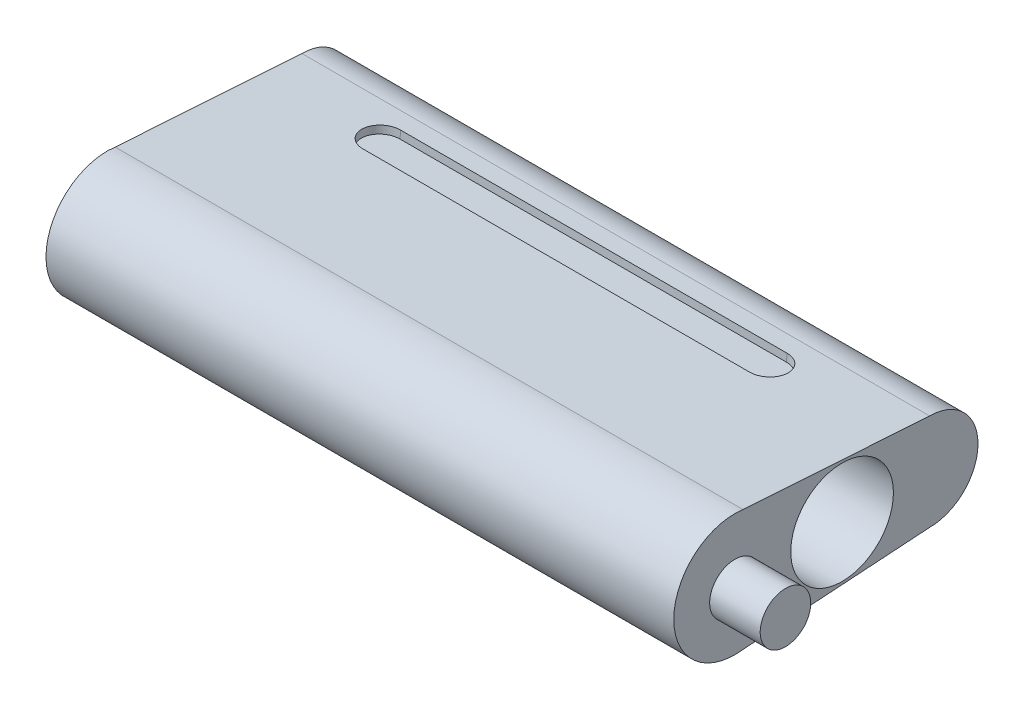
ISO-10303-21;
HEADER;
FILE_DESCRIPTION(('STEP AP214'),'2;1');
FILE_NAME('part.step','',(''),(''),'','','');
FILE_SCHEMA(('AUTOMOTIVE_DESIGN { 1 0 10303 214 1 1 1 1 }'));
ENDSEC;
DATA;
#1=APPLICATION_CONTEXT('core data for automotive mechanical design processes');
#2=APPLICATION_PROTOCOL_DEFINITION('international standard','automotive_design',2000,#1);
#3=PRODUCT_CONTEXT('',#1,'mechanical');
#4=PRODUCT('Part','Part','',(#3));
#5=PRODUCT_RELATED_PRODUCT_CATEGORY('part','',(#4));
#6=PRODUCT_DEFINITION_FORMATION('','',#4);
#7=PRODUCT_DEFINITION_CONTEXT('part definition',#1,'design');
#8=PRODUCT_DEFINITION('design','',#6,#7);
#9=PRODUCT_DEFINITION_SHAPE('','',#8);
#10=(LENGTH_UNIT() NAMED_UNIT(*) SI_UNIT(.MILLI.,.METRE.));
#11=(NAMED_UNIT(*) PLANE_ANGLE_UNIT() SI_UNIT($,.RADIAN.));
#12=(NAMED_UNIT(*) SI_UNIT($,.STERADIAN.) SOLID_ANGLE_UNIT());
#13=UNCERTAINTY_MEASURE_WITH_UNIT(LENGTH_MEASURE(1.E-05),#10,'distance_accuracy_value','');
#14=(GEOMETRIC_REPRESENTATION_CONTEXT(3) GLOBAL_UNCERTAINTY_ASSIGNED_CONTEXT((#13)) GLOBAL_UNIT_ASSIGNED_CONTEXT((#10,
#11,#12)) REPRESENTATION_CONTEXT('',''));
#15=CARTESIAN_POINT('',(0.,0.,0.));
#16=DIRECTION('',(0.,0.,1.));
#17=DIRECTION('',(1.,0.,0.));
#18=AXIS2_PLACEMENT_3D('',#15,#16,#17);
#19=CARTESIAN_POINT('',(12.4192495140172,0.,0.));
#20=DIRECTION('',(-1.,0.,0.));
#21=DIRECTION('',(0.,0.,1.));
#22=AXIS2_PLACEMENT_3D('',#19,#20,#21);
#23=CYLINDRICAL_SURFACE('',#22,1.20962475700856);
#24=CARTESIAN_POINT('',(0.,0.,0.));
#25=DIRECTION('',(1.,0.,0.));
#26=DIRECTION('',(0.,0.,-1.));
#27=AXIS2_PLACEMENT_3D('',#24,#25,#26);
#28=CIRCLE('',#27,1.20962475700856);
#29=CARTESIAN_POINT('',(0.,1.19906290371935,-0.159499861103787));
#30=VERTEX_POINT('',#29);
#31=CARTESIAN_POINT('',(0.,-1.19906290371935,-0.159499861103784));
#32=VERTEX_POINT('',#31);
#33=EDGE_CURVE('E168',#30,#32,#28,.T.);
#34=ORIENTED_EDGE('',*,*,#33,.T.);
#35=DIRECTION('',(-1.,0.,0.));
#36=VECTOR('',#35,1.);
#37=CARTESIAN_POINT('',(12.4192495140172,-1.19906290371935,-0.159499861103784));
#38=LINE('',#37,#36);
#39=CARTESIAN_POINT('',(12.4192495140172,-1.19906290371935,-0.159499861103784));
#40=VERTEX_POINT('',#39);
#41=EDGE_CURVE('E50',#40,#32,#38,.T.);
#42=ORIENTED_EDGE('',*,*,#41,.F.);
#43=CARTESIAN_POINT('',(12.4192495140172,0.,0.));
#44=DIRECTION('',(1.,0.,0.));
#45=DIRECTION('',(0.,0.,-1.));
#46=AXIS2_PLACEMENT_3D('',#43,#44,#45);
#47=CIRCLE('',#46,1.20962475700856);
#48=CARTESIAN_POINT('',(12.4192495140172,1.19906290371935,-0.159499861103787));
#49=VERTEX_POINT('',#48);
#50=EDGE_CURVE('E159',#49,#40,#47,.T.);
#51=ORIENTED_EDGE('',*,*,#50,.F.);
#52=DIRECTION('',(-1.,0.,0.));
#53=VECTOR('',#52,1.);
#54=CARTESIAN_POINT('',(12.4192495140172,1.19906290371935,-0.159499861103787));
#55=LINE('',#54,#53);
#56=EDGE_CURVE('E63',#49,#30,#55,.T.);
#57=ORIENTED_EDGE('',*,*,#56,.T.);
#58=EDGE_LOOP('',(#34,#42,#51,#57));
#59=FACE_BOUND('',#58,.T.);
#60=ADVANCED_FACE('F39',(#59),#23,.T.);
#61=CARTESIAN_POINT('',(12.4192495140172,-1.19906290371935,-0.159499861103784));
#62=DIRECTION('',(0.,0.997814734263866,0.0660738684044652));
#63=DIRECTION('',(0.,-0.0660738684044652,0.997814734263866));
#64=AXIS2_PLACEMENT_3D('',#61,#62,#63);
#65=PLANE('',#64);
#66=DIRECTION('',(0.,0.0660738684044652,-0.997814734263866));
#67=VECTOR('',#66,1.);
#68=CARTESIAN_POINT('',(0.,-1.19906290371935,-0.159499861103784));
#69=LINE('',#68,#67);
#70=CARTESIAN_POINT('',(0.,-0.954395011226381,-3.85435281925565));
#71=VERTEX_POINT('',#70);
#72=EDGE_CURVE('E166',#32,#71,#69,.T.);
#73=ORIENTED_EDGE('',*,*,#72,.T.);
#74=DIRECTION('',(-1.,0.,0.));
#75=VECTOR('',#74,1.);
#76=CARTESIAN_POINT('',(12.4192495140172,-0.954395011226381,-3.85435281925565));
#77=LINE('',#76,#75);
#78=CARTESIAN_POINT('',(12.4192495140172,-0.954395011226381,-3.85435281925565));
#79=VERTEX_POINT('',#78);
#80=EDGE_CURVE('E178',#79,#71,#77,.T.);
#81=ORIENTED_EDGE('',*,*,#80,.F.);
#82=DIRECTION('',(0.,0.0660738684044652,-0.997814734263866));
#83=VECTOR('',#82,1.);
#84=CARTESIAN_POINT('',(12.4192495140172,-1.19906290371935,-0.159499861103784));
#85=LINE('',#84,#83);
#86=EDGE_CURVE('E92',#40,#79,#85,.T.);
#87=ORIENTED_EDGE('',*,*,#86,.F.);
#88=ORIENTED_EDGE('',*,*,#41,.T.);
#89=EDGE_LOOP('',(#73,#81,#87,#88));
#90=FACE_BOUND('',#89,.T.);
#91=ADVANCED_FACE('F181',(#90),#65,.F.);
#92=CARTESIAN_POINT('',(12.4192495140172,0.,-3.85435281925565));
#93=DIRECTION('',(-1.,0.,0.));
#94=DIRECTION('',(0.,0.,1.));
#95=AXIS2_PLACEMENT_3D('',#92,#93,#94);
#96=CYLINDRICAL_SURFACE('',#95,0.954395011226381);
#97=CARTESIAN_POINT('',(0.,0.,-3.85435281925565));
#98=DIRECTION('',(1.,0.,0.));
#99=DIRECTION('',(0.,0.,-1.));
#100=AXIS2_PLACEMENT_3D('',#97,#98,#99);
#101=CIRCLE('',#100,0.954395011226381);
#102=CARTESIAN_POINT('',(0.,0.954395011226381,-3.85435281925565));
#103=VERTEX_POINT('',#102);
#104=EDGE_CURVE('E167',#71,#103,#101,.T.);
#105=ORIENTED_EDGE('',*,*,#104,.T.);
#106=DIRECTION('',(-1.,0.,0.));
#107=VECTOR('',#106,1.);
#108=CARTESIAN_POINT('',(12.4192495140172,0.954395011226381,-3.85435281925565));
#109=LINE('',#108,#107);
#110=CARTESIAN_POINT('',(12.4192495140172,0.954395011226381,-3.85435281925565));
#111=VERTEX_POINT('',#110);
#112=EDGE_CURVE('E176',#111,#103,#109,.T.);
#113=ORIENTED_EDGE('',*,*,#112,.F.);
#114=CARTESIAN_POINT('',(12.4192495140172,0.,-3.85435281925565));
#115=DIRECTION('',(1.,0.,0.));
#116=DIRECTION('',(0.,0.,-1.));
#117=AXIS2_PLACEMENT_3D('',#114,#115,#116);
#118=CIRCLE('',#117,0.954395011226381);
#119=EDGE_CURVE('E162',#79,#111,#118,.T.);
#120=ORIENTED_EDGE('',*,*,#119,.F.);
#121=ORIENTED_EDGE('',*,*,#80,.T.);
#122=EDGE_LOOP('',(#105,#113,#120,#121));
#123=FACE_BOUND('',#122,.T.);
#124=ADVANCED_FACE('F188',(#123),#96,.T.);
#125=CARTESIAN_POINT('',(12.4192495140172,1.19906290371935,-0.159499861103787));
#126=DIRECTION('',(0.,0.997814734263866,-0.0660738684044652));
#127=DIRECTION('',(0.,0.0660738684044652,0.997814734263866));
#128=AXIS2_PLACEMENT_3D('',#125,#126,#127);
#129=PLANE('',#128);
#130=CARTESIAN_POINT('',(2.31054073287263,1.002900322382,-3.12184970826995));
#131=DIRECTION('',(0.,0.997814734263866,-0.0660738684044652));
#132=DIRECTION('',(0.,0.0660738684044652,0.997814734263866));
#133=AXIS2_PLACEMENT_3D('',#130,#131,#132);
#134=CIRCLE('',#133,0.373048868582557);
#135=CARTESIAN_POINT('',(2.31054073287263,0.978251540530843,-3.49408336594209));
#136=VERTEX_POINT('',#135);
#137=CARTESIAN_POINT('',(2.31054073287263,1.02754910423316,-2.74961605059781));
#138=VERTEX_POINT('',#137);
#139=EDGE_CURVE('E54',#136,#138,#134,.T.);
#140=ORIENTED_EDGE('',*,*,#139,.F.);
#141=DIRECTION('',(-1.,0.,0.));
#142=VECTOR('',#141,1.);
#143=CARTESIAN_POINT('',(2.31054073287263,0.978251540530843,-3.49408336594209));
#144=LINE('',#143,#142);
#145=CARTESIAN_POINT('',(9.95593601481911,0.978251540530843,-3.49408336594209));
#146=VERTEX_POINT('',#145);
#147=EDGE_CURVE('E131',#146,#136,#144,.T.);
#148=ORIENTED_EDGE('',*,*,#147,.F.);
#149=CARTESIAN_POINT('',(9.95593601481911,1.002900322382,-3.12184970826995));
#150=DIRECTION('',(0.,0.997814734263866,-0.0660738684044652));
#151=DIRECTION('',(0.,0.0660738684044652,0.997814734263866));
#152=AXIS2_PLACEMENT_3D('',#149,#150,#151);
#153=CIRCLE('',#152,0.373048868582557);
#154=CARTESIAN_POINT('',(9.95593601481911,1.02754910423316,-2.74961605059781));
#155=VERTEX_POINT('',#154);
#156=EDGE_CURVE('E140',#155,#146,#153,.T.);
#157=ORIENTED_EDGE('',*,*,#156,.F.);
#158=DIRECTION('',(1.,0.,0.));
#159=VECTOR('',#158,1.);
#160=CARTESIAN_POINT('',(2.31054073287263,1.02754910423316,-2.74961605059781));
#161=LINE('',#160,#159);
#162=EDGE_CURVE('E141',#138,#155,#161,.T.);
#163=ORIENTED_EDGE('',*,*,#162,.F.);
#164=EDGE_LOOP('',(#140,#148,#157,#163));
#165=FACE_BOUND('',#164,.T.);
#166=DIRECTION('',(0.,-0.0660738684044652,-0.997814734263866));
#167=VECTOR('',#166,1.);
#168=CARTESIAN_POINT('',(0.,1.19906290371935,-0.159499861103787));
#169=LINE('',#168,#167);
#170=EDGE_CURVE('E158',#30,#103,#169,.T.);
#171=ORIENTED_EDGE('',*,*,#170,.F.);
#172=ORIENTED_EDGE('',*,*,#56,.F.);
#173=DIRECTION('',(0.,-0.0660738684044652,-0.997814734263866));
#174=VECTOR('',#173,1.);
#175=CARTESIAN_POINT('',(12.4192495140172,1.19906290371935,-0.159499861103787));
#176=LINE('',#175,#174);
#177=EDGE_CURVE('E165',#49,#111,#176,.T.);
#178=ORIENTED_EDGE('',*,*,#177,.T.);
#179=ORIENTED_EDGE('',*,*,#112,.T.);
#180=EDGE_LOOP('',(#171,#172,#178,#179));
#181=FACE_BOUND('',#180,.T.);
#182=ADVANCED_FACE('F184',(#165,#181),#129,.T.);
#183=CARTESIAN_POINT('',(12.4192495140172,0.,0.));
#184=DIRECTION('',(1.,0.,0.));
#185=DIRECTION('',(0.,0.,-1.));
#186=AXIS2_PLACEMENT_3D('',#183,#184,#185);
#187=PLANE('',#186);
#188=CARTESIAN_POINT('',(12.4192495140172,-0.0732378778686819,0.));
#189=DIRECTION('',(1.,0.,0.));
#190=DIRECTION('',(0.,0.,-1.));
#191=AXIS2_PLACEMENT_3D('',#188,#189,#190);
#192=CIRCLE('',#191,0.5);
#193=CARTESIAN_POINT('',(12.4192495140172,-0.0732378778686819,-0.5));
#194=VERTEX_POINT('',#193);
#195=EDGE_CURVE('E11',#194,#194,#192,.T.);
#196=ORIENTED_EDGE('',*,*,#195,.F.);
#197=EDGE_LOOP('',(#196));
#198=FACE_BOUND('',#197,.T.);
#199=CARTESIAN_POINT('',(12.4192495140172,0.,-2.12008308742262));
#200=DIRECTION('',(1.,0.,0.));
#201=DIRECTION('',(0.,0.,-1.));
#202=AXIS2_PLACEMENT_3D('',#199,#200,#201);
#203=CIRCLE('',#202,1.01561898443626);
#204=CARTESIAN_POINT('',(12.4192495140172,0.,-3.13570207185888));
#205=VERTEX_POINT('',#204);
#206=EDGE_CURVE('E151',#205,#205,#203,.T.);
#207=ORIENTED_EDGE('',*,*,#206,.F.);
#208=EDGE_LOOP('',(#207));
#209=FACE_BOUND('',#208,.T.);
#210=ORIENTED_EDGE('',*,*,#50,.T.);
#211=ORIENTED_EDGE('',*,*,#86,.T.);
#212=ORIENTED_EDGE('',*,*,#119,.T.);
#213=ORIENTED_EDGE('',*,*,#177,.F.);
#214=EDGE_LOOP('',(#210,#211,#212,#213));
#215=FACE_BOUND('',#214,.T.);
#216=ADVANCED_FACE('F195',(#198,#209,#215),#187,.T.);
#217=CARTESIAN_POINT('',(0.,0.,0.));
#218=DIRECTION('',(1.,0.,0.));
#219=DIRECTION('',(0.,0.,-1.));
#220=AXIS2_PLACEMENT_3D('',#217,#218,#219);
#221=PLANE('',#220);
#222=CARTESIAN_POINT('',(0.,0.,-2.12008308742262));
#223=DIRECTION('',(1.,0.,0.));
#224=DIRECTION('',(0.,0.,-1.));
#225=AXIS2_PLACEMENT_3D('',#222,#223,#224);
#226=CIRCLE('',#225,1.01561898443626);
#227=CARTESIAN_POINT('',(0.,0.,-3.13570207185888));
#228=VERTEX_POINT('',#227);
#229=EDGE_CURVE('E45',#228,#228,#226,.T.);
#230=ORIENTED_EDGE('',*,*,#229,.T.);
#231=EDGE_LOOP('',(#230));
#232=FACE_BOUND('',#231,.T.);
#233=ORIENTED_EDGE('',*,*,#33,.F.);
#234=ORIENTED_EDGE('',*,*,#170,.T.);
#235=ORIENTED_EDGE('',*,*,#104,.F.);
#236=ORIENTED_EDGE('',*,*,#72,.F.);
#237=EDGE_LOOP('',(#233,#234,#235,#236));
#238=FACE_BOUND('',#237,.T.);
#239=ADVANCED_FACE('F182',(#232,#238),#221,.F.);
#240=CARTESIAN_POINT('',(-1.,0.,-2.12008308742262));
#241=DIRECTION('',(1.,0.,0.));
#242=DIRECTION('',(0.,0.,-1.));
#243=AXIS2_PLACEMENT_3D('',#240,#241,#242);
#244=CYLINDRICAL_SURFACE('',#243,1.01561898443626);
#245=ORIENTED_EDGE('',*,*,#206,.T.);
#246=EDGE_LOOP('',(#245));
#247=FACE_BOUND('',#246,.T.);
#248=ORIENTED_EDGE('',*,*,#229,.F.);
#249=EDGE_LOOP('',(#248));
#250=FACE_BOUND('',#249,.T.);
#251=ADVANCED_FACE('F202',(#247,#250),#244,.F.);
#252=CARTESIAN_POINT('',(13.4192495140172,-0.0732378778686819,0.));
#253=DIRECTION('',(-1.,0.,0.));
#254=DIRECTION('',(0.,0.,1.));
#255=AXIS2_PLACEMENT_3D('',#252,#253,#254);
#256=CYLINDRICAL_SURFACE('',#255,0.5);
#257=CARTESIAN_POINT('',(13.4192495140172,-0.0732378778686819,0.));
#258=DIRECTION('',(1.,0.,0.));
#259=DIRECTION('',(0.,0.,-1.));
#260=AXIS2_PLACEMENT_3D('',#257,#258,#259);
#261=CIRCLE('',#260,0.5);
#262=CARTESIAN_POINT('',(13.4192495140172,-0.0732378778686819,-0.5));
#263=VERTEX_POINT('',#262);
#264=EDGE_CURVE('E148',#263,#263,#261,.T.);
#265=ORIENTED_EDGE('',*,*,#264,.F.);
#266=EDGE_LOOP('',(#265));
#267=FACE_BOUND('',#266,.T.);
#268=ORIENTED_EDGE('',*,*,#195,.T.);
#269=EDGE_LOOP('',(#268));
#270=FACE_BOUND('',#269,.T.);
#271=ADVANCED_FACE('F233',(#267,#270),#256,.T.);
#272=CARTESIAN_POINT('',(13.4192495140172,-0.0732378778686819,0.));
#273=DIRECTION('',(1.,0.,0.));
#274=DIRECTION('',(0.,0.,-1.));
#275=AXIS2_PLACEMENT_3D('',#272,#273,#274);
#276=PLANE('',#275);
#277=ORIENTED_EDGE('',*,*,#264,.T.);
#278=EDGE_LOOP('',(#277));
#279=FACE_BOUND('',#278,.T.);
#280=ADVANCED_FACE('F245',(#279),#276,.T.);
#281=CARTESIAN_POINT('',(2.31054073287263,0.853228112242422,-3.11193862800928));
#282=DIRECTION('',(0.,0.997814734263866,-0.0660738684044652));
#283=DIRECTION('',(0.,0.0660738684044652,0.997814734263866));
#284=AXIS2_PLACEMENT_3D('',#281,#282,#283);
#285=CYLINDRICAL_SURFACE('',#284,0.373048868582557);
#286=ORIENTED_EDGE('',*,*,#139,.T.);
#287=DIRECTION('',(0.,0.997814734263866,-0.0660738684044652));
#288=VECTOR('',#287,1.);
#289=CARTESIAN_POINT('',(2.31054073287263,0.87787689409358,-2.73970497033714));
#290=LINE('',#289,#288);
#291=CARTESIAN_POINT('',(2.31054073287263,0.87787689409358,-2.73970497033714));
#292=VERTEX_POINT('',#291);
#293=EDGE_CURVE('E115',#292,#138,#290,.T.);
#294=ORIENTED_EDGE('',*,*,#293,.F.);
#295=CARTESIAN_POINT('',(2.31054073287263,0.853228112242422,-3.11193862800928));
#296=DIRECTION('',(0.,0.997814734263866,-0.0660738684044652));
#297=DIRECTION('',(0.,0.0660738684044652,0.997814734263866));
#298=AXIS2_PLACEMENT_3D('',#295,#296,#297);
#299=CIRCLE('',#298,0.373048868582557);
#300=CARTESIAN_POINT('',(2.31054073287263,0.828579330391263,-3.48417228568142));
#301=VERTEX_POINT('',#300);
#302=EDGE_CURVE('E116',#301,#292,#299,.T.);
#303=ORIENTED_EDGE('',*,*,#302,.F.);
#304=DIRECTION('',(0.,0.997814734263866,-0.0660738684044652));
#305=VECTOR('',#304,1.);
#306=CARTESIAN_POINT('',(2.31054073287263,0.828579330391263,-3.48417228568142));
#307=LINE('',#306,#305);
#308=EDGE_CURVE('E150',#301,#136,#307,.T.);
#309=ORIENTED_EDGE('',*,*,#308,.T.);
#310=EDGE_LOOP('',(#286,#294,#303,#309));
#311=FACE_BOUND('',#310,.T.);
#312=ADVANCED_FACE('F112',(#311),#285,.F.);
#313=CARTESIAN_POINT('',(2.31054073287263,0.828579330391263,-3.48417228568142));
#314=DIRECTION('',(0.,-0.0660738684044652,-0.997814734263866));
#315=DIRECTION('',(0.,0.997814734263866,-0.0660738684044652));
#316=AXIS2_PLACEMENT_3D('',#313,#314,#315);
#317=PLANE('',#316);
#318=ORIENTED_EDGE('',*,*,#147,.T.);
#319=ORIENTED_EDGE('',*,*,#308,.F.);
#320=DIRECTION('',(-1.,0.,0.));
#321=VECTOR('',#320,1.);
#322=CARTESIAN_POINT('',(2.31054073287263,0.828579330391263,-3.48417228568142));
#323=LINE('',#322,#321);
#324=CARTESIAN_POINT('',(9.95593601481911,0.828579330391263,-3.48417228568142));
#325=VERTEX_POINT('',#324);
#326=EDGE_CURVE('E125',#325,#301,#323,.T.);
#327=ORIENTED_EDGE('',*,*,#326,.F.);
#328=DIRECTION('',(0.,0.997814734263866,-0.0660738684044652));
#329=VECTOR('',#328,1.);
#330=CARTESIAN_POINT('',(9.95593601481911,0.828579330391263,-3.48417228568142));
#331=LINE('',#330,#329);
#332=EDGE_CURVE('E149',#325,#146,#331,.T.);
#333=ORIENTED_EDGE('',*,*,#332,.T.);
#334=EDGE_LOOP('',(#318,#319,#327,#333));
#335=FACE_BOUND('',#334,.T.);
#336=ADVANCED_FACE('F262',(#335),#317,.F.);
#337=CARTESIAN_POINT('',(9.95593601481911,0.853228112242422,-3.11193862800928));
#338=DIRECTION('',(0.,0.997814734263866,-0.0660738684044652));
#339=DIRECTION('',(0.,0.0660738684044652,0.997814734263866));
#340=AXIS2_PLACEMENT_3D('',#337,#338,#339);
#341=CYLINDRICAL_SURFACE('',#340,0.373048868582557);
#342=ORIENTED_EDGE('',*,*,#156,.T.);
#343=ORIENTED_EDGE('',*,*,#332,.F.);
#344=CARTESIAN_POINT('',(9.95593601481911,0.853228112242422,-3.11193862800928));
#345=DIRECTION('',(0.,0.997814734263866,-0.0660738684044652));
#346=DIRECTION('',(0.,0.0660738684044652,0.997814734263866));
#347=AXIS2_PLACEMENT_3D('',#344,#345,#346);
#348=CIRCLE('',#347,0.373048868582557);
#349=CARTESIAN_POINT('',(9.95593601481911,0.87787689409358,-2.73970497033714));
#350=VERTEX_POINT('',#349);
#351=EDGE_CURVE('E129',#350,#325,#348,.T.);
#352=ORIENTED_EDGE('',*,*,#351,.F.);
#353=DIRECTION('',(0.,0.997814734263866,-0.0660738684044652));
#354=VECTOR('',#353,1.);
#355=CARTESIAN_POINT('',(9.95593601481911,0.87787689409358,-2.73970497033714));
#356=LINE('',#355,#354);
#357=EDGE_CURVE('E122',#350,#155,#356,.T.);
#358=ORIENTED_EDGE('',*,*,#357,.T.);
#359=EDGE_LOOP('',(#342,#343,#352,#358));
#360=FACE_BOUND('',#359,.T.);
#361=ADVANCED_FACE('F268',(#360),#341,.F.);
#362=CARTESIAN_POINT('',(2.31054073287263,0.87787689409358,-2.73970497033714));
#363=DIRECTION('',(0.,0.0660738684044652,0.997814734263866));
#364=DIRECTION('',(0.,-0.997814734263866,0.0660738684044652));
#365=AXIS2_PLACEMENT_3D('',#362,#363,#364);
#366=PLANE('',#365);
#367=ORIENTED_EDGE('',*,*,#162,.T.);
#368=ORIENTED_EDGE('',*,*,#357,.F.);
#369=DIRECTION('',(1.,0.,0.));
#370=VECTOR('',#369,1.);
#371=CARTESIAN_POINT('',(2.31054073287263,0.87787689409358,-2.73970497033714));
#372=LINE('',#371,#370);
#373=EDGE_CURVE('E123',#292,#350,#372,.T.);
#374=ORIENTED_EDGE('',*,*,#373,.F.);
#375=ORIENTED_EDGE('',*,*,#293,.T.);
#376=EDGE_LOOP('',(#367,#368,#374,#375));
#377=FACE_BOUND('',#376,.T.);
#378=ADVANCED_FACE('F126',(#377),#366,.F.);
#379=CARTESIAN_POINT('',(2.31054073287263,0.853228112242422,-3.11193862800928));
#380=DIRECTION('',(0.,0.997814734263866,-0.0660738684044652));
#381=DIRECTION('',(0.,0.0660738684044652,0.997814734263866));
#382=AXIS2_PLACEMENT_3D('',#379,#380,#381);
#383=PLANE('',#382);
#384=ORIENTED_EDGE('',*,*,#302,.T.);
#385=ORIENTED_EDGE('',*,*,#373,.T.);
#386=ORIENTED_EDGE('',*,*,#351,.T.);
#387=ORIENTED_EDGE('',*,*,#326,.T.);
#388=EDGE_LOOP('',(#384,#385,#386,#387));
#389=FACE_BOUND('',#388,.T.);
#390=ADVANCED_FACE('F135',(#389),#383,.T.);
#391=CLOSED_SHELL('',(#60,#91,#124,#182,#216,#239,#251,#271,#280,#312,#336,#361,#378,#390));
#392=MANIFOLD_SOLID_BREP('B2',#391);
#393=ADVANCED_BREP_SHAPE_REPRESENTATION('',(#18,#392),#14);
#394=SHAPE_DEFINITION_REPRESENTATION(#9,#393);
ENDSEC;
END-ISO-10303-21;
